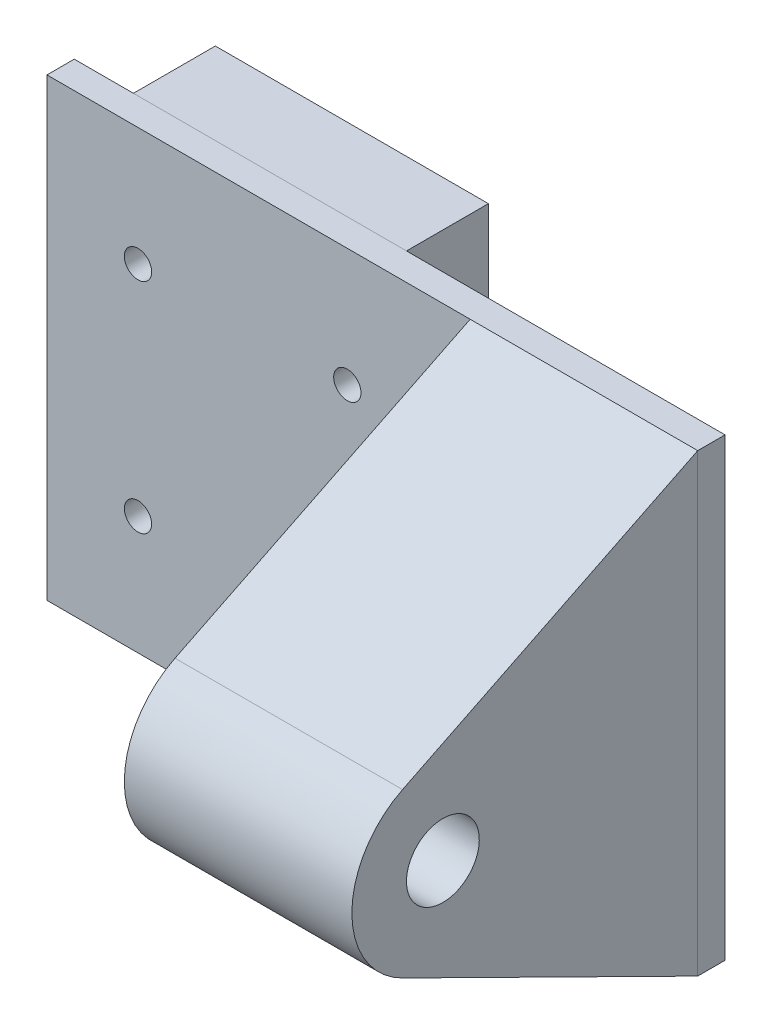
ISO-10303-21;
HEADER;
FILE_DESCRIPTION(('STEP AP214'),'2;1');
FILE_NAME('part.step','',(''),(''),'','','');
FILE_SCHEMA(('AUTOMOTIVE_DESIGN { 1 0 10303 214 1 1 1 1 }'));
ENDSEC;
DATA;
#1=APPLICATION_CONTEXT('core data for automotive mechanical design processes');
#2=APPLICATION_PROTOCOL_DEFINITION('international standard','automotive_design',2000,#1);
#3=PRODUCT_CONTEXT('',#1,'mechanical');
#4=PRODUCT('Part','Part','',(#3));
#5=PRODUCT_RELATED_PRODUCT_CATEGORY('part','',(#4));
#6=PRODUCT_DEFINITION_FORMATION('','',#4);
#7=PRODUCT_DEFINITION_CONTEXT('part definition',#1,'design');
#8=PRODUCT_DEFINITION('design','',#6,#7);
#9=PRODUCT_DEFINITION_SHAPE('','',#8);
#10=(LENGTH_UNIT() NAMED_UNIT(*) SI_UNIT(.MILLI.,.METRE.));
#11=(NAMED_UNIT(*) PLANE_ANGLE_UNIT() SI_UNIT($,.RADIAN.));
#12=(NAMED_UNIT(*) SI_UNIT($,.STERADIAN.) SOLID_ANGLE_UNIT());
#13=UNCERTAINTY_MEASURE_WITH_UNIT(LENGTH_MEASURE(1.E-05),#10,'distance_accuracy_value','');
#14=(GEOMETRIC_REPRESENTATION_CONTEXT(3) GLOBAL_UNCERTAINTY_ASSIGNED_CONTEXT((#13)) GLOBAL_UNIT_ASSIGNED_CONTEXT((#10,
#11,#12)) REPRESENTATION_CONTEXT('',''));
#15=CARTESIAN_POINT('',(0.,0.,0.));
#16=DIRECTION('',(0.,0.,1.));
#17=DIRECTION('',(1.,0.,0.));
#18=AXIS2_PLACEMENT_3D('',#15,#16,#17);
#19=CARTESIAN_POINT('',(40.,33.9641088775517,44.4322400692426));
#20=DIRECTION('',(0.,0.896410887755167,0.443224006924257));
#21=DIRECTION('',(0.,-0.443224006924257,0.896410887755167));
#22=AXIS2_PLACEMENT_3D('',#19,#20,#21);
#23=PLANE('',#22);
#24=DIRECTION('',(0.,-0.443224006924257,0.896410887755167));
#25=VECTOR('',#24,1.);
#26=CARTESIAN_POINT('',(65.,33.9641088775517,44.4322400692426));
#27=LINE('',#26,#25);
#28=CARTESIAN_POINT('',(65.,50.,12.));
#29=VERTEX_POINT('',#28);
#30=CARTESIAN_POINT('',(65.,33.9641088775517,44.4322400692426));
#31=VERTEX_POINT('',#30);
#32=EDGE_CURVE('E111',#29,#31,#27,.T.);
#33=ORIENTED_EDGE('',*,*,#32,.F.);
#34=DIRECTION('',(1.,0.,0.));
#35=VECTOR('',#34,1.);
#36=CARTESIAN_POINT('',(40.,50.,12.));
#37=LINE('',#36,#35);
#38=CARTESIAN_POINT('',(40.,50.,12.));
#39=VERTEX_POINT('',#38);
#40=EDGE_CURVE('E12',#39,#29,#37,.T.);
#41=ORIENTED_EDGE('',*,*,#40,.F.);
#42=DIRECTION('',(0.,-0.443224006924257,0.896410887755167));
#43=VECTOR('',#42,1.);
#44=CARTESIAN_POINT('',(40.,33.9641088775517,44.4322400692426));
#45=LINE('',#44,#43);
#46=CARTESIAN_POINT('',(40.,33.9641088775517,44.4322400692426));
#47=VERTEX_POINT('',#46);
#48=EDGE_CURVE('E104',#39,#47,#45,.T.);
#49=ORIENTED_EDGE('',*,*,#48,.T.);
#50=DIRECTION('',(1.,0.,0.));
#51=VECTOR('',#50,1.);
#52=CARTESIAN_POINT('',(40.,33.9641088775517,44.4322400692426));
#53=LINE('',#52,#51);
#54=EDGE_CURVE('E49',#47,#31,#53,.T.);
#55=ORIENTED_EDGE('',*,*,#54,.T.);
#56=EDGE_LOOP('',(#33,#41,#49,#55));
#57=FACE_BOUND('',#56,.T.);
#58=ADVANCED_FACE('F46',(#57),#23,.T.);
#59=CARTESIAN_POINT('',(40.,50.,12.));
#60=DIRECTION('',(0.,0.,-1.));
#61=DIRECTION('',(-1.,0.,0.));
#62=AXIS2_PLACEMENT_3D('',#59,#60,#61);
#63=PLANE('',#62);
#64=DIRECTION('',(0.,1.,0.));
#65=VECTOR('',#64,1.);
#66=CARTESIAN_POINT('',(65.,50.,12.));
#67=LINE('',#66,#65);
#68=CARTESIAN_POINT('',(65.,0.,12.));
#69=VERTEX_POINT('',#68);
#70=EDGE_CURVE('E106',#69,#29,#67,.T.);
#71=ORIENTED_EDGE('',*,*,#70,.F.);
#72=DIRECTION('',(1.,0.,0.));
#73=VECTOR('',#72,1.);
#74=CARTESIAN_POINT('',(40.,0.,12.));
#75=LINE('',#74,#73);
#76=CARTESIAN_POINT('',(40.,0.,12.));
#77=VERTEX_POINT('',#76);
#78=EDGE_CURVE('E55',#77,#69,#75,.T.);
#79=ORIENTED_EDGE('',*,*,#78,.F.);
#80=DIRECTION('',(0.,1.,0.));
#81=VECTOR('',#80,1.);
#82=CARTESIAN_POINT('',(40.,50.,12.));
#83=LINE('',#82,#81);
#84=EDGE_CURVE('E101',#77,#39,#83,.T.);
#85=ORIENTED_EDGE('',*,*,#84,.T.);
#86=ORIENTED_EDGE('',*,*,#40,.T.);
#87=EDGE_LOOP('',(#71,#79,#85,#86));
#88=FACE_BOUND('',#87,.T.);
#89=ADVANCED_FACE('F122',(#88),#63,.T.);
#90=CARTESIAN_POINT('',(40.,0.,12.));
#91=DIRECTION('',(0.,-0.896410887755167,0.443224006924256));
#92=DIRECTION('',(0.,-0.443224006924256,-0.896410887755167));
#93=AXIS2_PLACEMENT_3D('',#90,#91,#92);
#94=PLANE('',#93);
#95=DIRECTION('',(0.,-0.443224006924256,-0.896410887755167));
#96=VECTOR('',#95,1.);
#97=CARTESIAN_POINT('',(65.,0.,12.));
#98=LINE('',#97,#96);
#99=CARTESIAN_POINT('',(65.,16.0358911224483,44.4322400692426));
#100=VERTEX_POINT('',#99);
#101=EDGE_CURVE('E96',#100,#69,#98,.T.);
#102=ORIENTED_EDGE('',*,*,#101,.F.);
#103=DIRECTION('',(1.,0.,0.));
#104=VECTOR('',#103,1.);
#105=CARTESIAN_POINT('',(40.,16.0358911224483,44.4322400692426));
#106=LINE('',#105,#104);
#107=CARTESIAN_POINT('',(40.,16.0358911224483,44.4322400692426));
#108=VERTEX_POINT('',#107);
#109=EDGE_CURVE('E91',#108,#100,#106,.T.);
#110=ORIENTED_EDGE('',*,*,#109,.F.);
#111=DIRECTION('',(0.,-0.443224006924256,-0.896410887755167));
#112=VECTOR('',#111,1.);
#113=CARTESIAN_POINT('',(40.,0.,12.));
#114=LINE('',#113,#112);
#115=EDGE_CURVE('E94',#108,#77,#114,.T.);
#116=ORIENTED_EDGE('',*,*,#115,.T.);
#117=ORIENTED_EDGE('',*,*,#78,.T.);
#118=EDGE_LOOP('',(#102,#110,#116,#117));
#119=FACE_BOUND('',#118,.T.);
#120=ADVANCED_FACE('F93',(#119),#94,.T.);
#121=CARTESIAN_POINT('',(40.,25.,40.));
#122=DIRECTION('',(1.,0.,0.));
#123=DIRECTION('',(0.,1.,0.));
#124=AXIS2_PLACEMENT_3D('',#121,#122,#123);
#125=CYLINDRICAL_SURFACE('',#124,10.);
#126=CARTESIAN_POINT('',(65.,25.,40.));
#127=DIRECTION('',(1.,0.,0.));
#128=DIRECTION('',(0.,1.,0.));
#129=AXIS2_PLACEMENT_3D('',#126,#127,#128);
#130=CIRCLE('',#129,10.);
#131=EDGE_CURVE('E114',#31,#100,#130,.T.);
#132=ORIENTED_EDGE('',*,*,#131,.F.);
#133=ORIENTED_EDGE('',*,*,#54,.F.);
#134=CARTESIAN_POINT('',(40.,25.,40.));
#135=DIRECTION('',(1.,0.,0.));
#136=DIRECTION('',(0.,1.,0.));
#137=AXIS2_PLACEMENT_3D('',#134,#135,#136);
#138=CIRCLE('',#137,10.);
#139=EDGE_CURVE('E100',#47,#108,#138,.T.);
#140=ORIENTED_EDGE('',*,*,#139,.T.);
#141=ORIENTED_EDGE('',*,*,#109,.T.);
#142=EDGE_LOOP('',(#132,#133,#140,#141));
#143=FACE_BOUND('',#142,.T.);
#144=ADVANCED_FACE('F103',(#143),#125,.T.);
#145=CARTESIAN_POINT('',(40.,25.,40.));
#146=DIRECTION('',(1.,0.,0.));
#147=DIRECTION('',(0.,1.,0.));
#148=AXIS2_PLACEMENT_3D('',#145,#146,#147);
#149=PLANE('',#148);
#150=CARTESIAN_POINT('',(40.,25.,40.));
#151=DIRECTION('',(1.,0.,0.));
#152=DIRECTION('',(0.,1.,0.));
#153=AXIS2_PLACEMENT_3D('',#150,#151,#152);
#154=CIRCLE('',#153,4.00000000000001);
#155=CARTESIAN_POINT('',(40.,29.,40.));
#156=VERTEX_POINT('',#155);
#157=EDGE_CURVE('E115',#156,#156,#154,.T.);
#158=ORIENTED_EDGE('',*,*,#157,.T.);
#159=EDGE_LOOP('',(#158));
#160=FACE_BOUND('',#159,.T.);
#161=ORIENTED_EDGE('',*,*,#48,.F.);
#162=ORIENTED_EDGE('',*,*,#84,.F.);
#163=ORIENTED_EDGE('',*,*,#115,.F.);
#164=ORIENTED_EDGE('',*,*,#139,.F.);
#165=EDGE_LOOP('',(#161,#162,#163,#164));
#166=FACE_BOUND('',#165,.T.);
#167=ADVANCED_FACE('F99',(#160,#166),#149,.F.);
#168=CARTESIAN_POINT('',(65.,25.,40.));
#169=DIRECTION('',(1.,0.,0.));
#170=DIRECTION('',(0.,1.,0.));
#171=AXIS2_PLACEMENT_3D('',#168,#169,#170);
#172=PLANE('',#171);
#173=CARTESIAN_POINT('',(65.,25.,40.));
#174=DIRECTION('',(1.,0.,0.));
#175=DIRECTION('',(0.,1.,0.));
#176=AXIS2_PLACEMENT_3D('',#173,#174,#175);
#177=CIRCLE('',#176,4.00000000000001);
#178=CARTESIAN_POINT('',(65.,29.,40.));
#179=VERTEX_POINT('',#178);
#180=EDGE_CURVE('E152',#179,#179,#177,.T.);
#181=ORIENTED_EDGE('',*,*,#180,.F.);
#182=EDGE_LOOP('',(#181));
#183=FACE_BOUND('',#182,.T.);
#184=ORIENTED_EDGE('',*,*,#32,.T.);
#185=ORIENTED_EDGE('',*,*,#131,.T.);
#186=ORIENTED_EDGE('',*,*,#101,.T.);
#187=ORIENTED_EDGE('',*,*,#70,.T.);
#188=EDGE_LOOP('',(#184,#185,#186,#187));
#189=FACE_BOUND('',#188,.T.);
#190=ADVANCED_FACE('F121',(#183,#189),#172,.T.);
#191=CARTESIAN_POINT('',(40.,25.,40.));
#192=DIRECTION('',(1.,0.,0.));
#193=DIRECTION('',(0.,1.,0.));
#194=AXIS2_PLACEMENT_3D('',#191,#192,#193);
#195=CYLINDRICAL_SURFACE('',#194,4.00000000000001);
#196=ORIENTED_EDGE('',*,*,#157,.F.);
#197=EDGE_LOOP('',(#196));
#198=FACE_BOUND('',#197,.T.);
#199=ORIENTED_EDGE('',*,*,#180,.T.);
#200=EDGE_LOOP('',(#199));
#201=FACE_BOUND('',#200,.T.);
#202=ADVANCED_FACE('F140',(#198,#201),#195,.F.);
#203=CLOSED_SHELL('',(#58,#89,#120,#144,#167,#190,#202));
#204=MANIFOLD_SOLID_BREP('B2',#203);
#205=CARTESIAN_POINT('',(-6.5,50.,12.));
#206=DIRECTION('',(1.,0.,0.));
#207=DIRECTION('',(0.,1.,0.));
#208=AXIS2_PLACEMENT_3D('',#205,#206,#207);
#209=PLANE('',#208);
#210=DIRECTION('',(0.,-1.,0.));
#211=VECTOR('',#210,1.);
#212=CARTESIAN_POINT('',(-6.5,50.,9.));
#213=LINE('',#212,#211);
#214=CARTESIAN_POINT('',(-6.5,50.,9.));
#215=VERTEX_POINT('',#214);
#216=CARTESIAN_POINT('',(-6.49999999999999,0.,9.));
#217=VERTEX_POINT('',#216);
#218=EDGE_CURVE('E266',#215,#217,#213,.T.);
#219=ORIENTED_EDGE('',*,*,#218,.T.);
#220=DIRECTION('',(0.,0.,-1.));
#221=VECTOR('',#220,1.);
#222=CARTESIAN_POINT('',(-6.49999999999999,0.,12.));
#223=LINE('',#222,#221);
#224=CARTESIAN_POINT('',(-6.49999999999999,0.,12.));
#225=VERTEX_POINT('',#224);
#226=EDGE_CURVE('E44',#225,#217,#223,.T.);
#227=ORIENTED_EDGE('',*,*,#226,.F.);
#228=DIRECTION('',(0.,-1.,0.));
#229=VECTOR('',#228,1.);
#230=CARTESIAN_POINT('',(-6.5,50.,12.));
#231=LINE('',#230,#229);
#232=CARTESIAN_POINT('',(-6.5,50.,12.));
#233=VERTEX_POINT('',#232);
#234=EDGE_CURVE('E253',#233,#225,#231,.T.);
#235=ORIENTED_EDGE('',*,*,#234,.F.);
#236=DIRECTION('',(0.,0.,-1.));
#237=VECTOR('',#236,1.);
#238=CARTESIAN_POINT('',(-6.5,50.,12.));
#239=LINE('',#238,#237);
#240=EDGE_CURVE('E262',#233,#215,#239,.T.);
#241=ORIENTED_EDGE('',*,*,#240,.T.);
#242=EDGE_LOOP('',(#219,#227,#235,#241));
#243=FACE_BOUND('',#242,.T.);
#244=ADVANCED_FACE('F200',(#243),#209,.F.);
#245=CARTESIAN_POINT('',(-6.49999999999999,0.,12.));
#246=DIRECTION('',(0.,1.,0.));
#247=DIRECTION('',(0.,0.,1.));
#248=AXIS2_PLACEMENT_3D('',#245,#246,#247);
#249=PLANE('',#248);
#250=DIRECTION('',(1.,0.,0.));
#251=VECTOR('',#250,1.);
#252=CARTESIAN_POINT('',(-6.49999999999999,0.,9.));
#253=LINE('',#252,#251);
#254=CARTESIAN_POINT('',(65.,0.,9.));
#255=VERTEX_POINT('',#254);
#256=EDGE_CURVE('E257',#217,#255,#253,.T.);
#257=ORIENTED_EDGE('',*,*,#256,.T.);
#258=DIRECTION('',(0.,0.,-1.));
#259=VECTOR('',#258,1.);
#260=CARTESIAN_POINT('',(65.,0.,12.));
#261=LINE('',#260,#259);
#262=CARTESIAN_POINT('',(65.,0.,12.));
#263=VERTEX_POINT('',#262);
#264=EDGE_CURVE('E209',#263,#255,#261,.T.);
#265=ORIENTED_EDGE('',*,*,#264,.F.);
#266=DIRECTION('',(1.,0.,0.));
#267=VECTOR('',#266,1.);
#268=CARTESIAN_POINT('',(-6.49999999999999,0.,12.));
#269=LINE('',#268,#267);
#270=EDGE_CURVE('E248',#225,#263,#269,.T.);
#271=ORIENTED_EDGE('',*,*,#270,.F.);
#272=ORIENTED_EDGE('',*,*,#226,.T.);
#273=EDGE_LOOP('',(#257,#265,#271,#272));
#274=FACE_BOUND('',#273,.T.);
#275=ADVANCED_FACE('F256',(#274),#249,.F.);
#276=CARTESIAN_POINT('',(65.,50.,12.));
#277=DIRECTION('',(-1.,0.,0.));
#278=DIRECTION('',(0.,0.,1.));
#279=AXIS2_PLACEMENT_3D('',#276,#277,#278);
#280=PLANE('',#279);
#281=DIRECTION('',(0.,1.,0.));
#282=VECTOR('',#281,1.);
#283=CARTESIAN_POINT('',(65.,50.,9.));
#284=LINE('',#283,#282);
#285=CARTESIAN_POINT('',(65.,50.,9.));
#286=VERTEX_POINT('',#285);
#287=EDGE_CURVE('E235',#255,#286,#284,.T.);
#288=ORIENTED_EDGE('',*,*,#287,.T.);
#289=DIRECTION('',(0.,0.,-1.));
#290=VECTOR('',#289,1.);
#291=CARTESIAN_POINT('',(65.,50.,12.));
#292=LINE('',#291,#290);
#293=CARTESIAN_POINT('',(65.,50.,12.));
#294=VERTEX_POINT('',#293);
#295=EDGE_CURVE('E258',#294,#286,#292,.T.);
#296=ORIENTED_EDGE('',*,*,#295,.F.);
#297=DIRECTION('',(0.,1.,0.));
#298=VECTOR('',#297,1.);
#299=CARTESIAN_POINT('',(65.,50.,12.));
#300=LINE('',#299,#298);
#301=EDGE_CURVE('E251',#263,#294,#300,.T.);
#302=ORIENTED_EDGE('',*,*,#301,.F.);
#303=ORIENTED_EDGE('',*,*,#264,.T.);
#304=EDGE_LOOP('',(#288,#296,#302,#303));
#305=FACE_BOUND('',#304,.T.);
#306=ADVANCED_FACE('F260',(#305),#280,.F.);
#307=CARTESIAN_POINT('',(-6.5,50.,12.));
#308=DIRECTION('',(0.,-1.,0.));
#309=DIRECTION('',(0.,0.,-1.));
#310=AXIS2_PLACEMENT_3D('',#307,#308,#309);
#311=PLANE('',#310);
#312=DIRECTION('',(-1.,0.,0.));
#313=VECTOR('',#312,1.);
#314=CARTESIAN_POINT('',(-6.5,50.,9.));
#315=LINE('',#314,#313);
#316=EDGE_CURVE('E241',#286,#215,#315,.T.);
#317=ORIENTED_EDGE('',*,*,#316,.T.);
#318=ORIENTED_EDGE('',*,*,#240,.F.);
#319=DIRECTION('',(-1.,0.,0.));
#320=VECTOR('',#319,1.);
#321=CARTESIAN_POINT('',(-6.5,50.,12.));
#322=LINE('',#321,#320);
#323=EDGE_CURVE('E218',#294,#233,#322,.T.);
#324=ORIENTED_EDGE('',*,*,#323,.F.);
#325=ORIENTED_EDGE('',*,*,#295,.T.);
#326=EDGE_LOOP('',(#317,#318,#324,#325));
#327=FACE_BOUND('',#326,.T.);
#328=ADVANCED_FACE('F304',(#327),#311,.F.);
#329=CARTESIAN_POINT('',(0.,0.,12.));
#330=DIRECTION('',(0.,0.,1.));
#331=DIRECTION('',(1.,0.,0.));
#332=AXIS2_PLACEMENT_3D('',#329,#330,#331);
#333=PLANE('',#332);
#334=CARTESIAN_POINT('',(3.49999999999999,37.,12.));
#335=DIRECTION('',(0.,0.,1.));
#336=DIRECTION('',(-1.,0.,0.));
#337=AXIS2_PLACEMENT_3D('',#334,#335,#336);
#338=CIRCLE('',#337,1.5);
#339=CARTESIAN_POINT('',(1.99999999999999,37.,12.));
#340=VERTEX_POINT('',#339);
#341=EDGE_CURVE('E293',#340,#340,#338,.T.);
#342=ORIENTED_EDGE('',*,*,#341,.F.);
#343=EDGE_LOOP('',(#342));
#344=FACE_BOUND('',#343,.T.);
#345=CARTESIAN_POINT('',(3.5,13.,12.));
#346=DIRECTION('',(0.,0.,1.));
#347=DIRECTION('',(1.,0.,0.));
#348=AXIS2_PLACEMENT_3D('',#345,#346,#347);
#349=CIRCLE('',#348,1.5);
#350=CARTESIAN_POINT('',(5.,13.,12.));
#351=VERTEX_POINT('',#350);
#352=EDGE_CURVE('E283',#351,#351,#349,.T.);
#353=ORIENTED_EDGE('',*,*,#352,.F.);
#354=EDGE_LOOP('',(#353));
#355=FACE_BOUND('',#354,.T.);
#356=CARTESIAN_POINT('',(26.5,13.,12.));
#357=DIRECTION('',(0.,0.,1.));
#358=DIRECTION('',(-1.,0.,0.));
#359=AXIS2_PLACEMENT_3D('',#356,#357,#358);
#360=CIRCLE('',#359,1.5);
#361=CARTESIAN_POINT('',(25.,13.,12.));
#362=VERTEX_POINT('',#361);
#363=EDGE_CURVE('E280',#362,#362,#360,.T.);
#364=ORIENTED_EDGE('',*,*,#363,.F.);
#365=EDGE_LOOP('',(#364));
#366=FACE_BOUND('',#365,.T.);
#367=CARTESIAN_POINT('',(26.5,37.,12.));
#368=DIRECTION('',(0.,0.,1.));
#369=DIRECTION('',(1.,0.,0.));
#370=AXIS2_PLACEMENT_3D('',#367,#368,#369);
#371=CIRCLE('',#370,1.5);
#372=CARTESIAN_POINT('',(28.,37.,12.));
#373=VERTEX_POINT('',#372);
#374=EDGE_CURVE('E277',#373,#373,#371,.T.);
#375=ORIENTED_EDGE('',*,*,#374,.F.);
#376=EDGE_LOOP('',(#375));
#377=FACE_BOUND('',#376,.T.);
#378=ORIENTED_EDGE('',*,*,#234,.T.);
#379=ORIENTED_EDGE('',*,*,#270,.T.);
#380=ORIENTED_EDGE('',*,*,#301,.T.);
#381=ORIENTED_EDGE('',*,*,#323,.T.);
#382=EDGE_LOOP('',(#378,#379,#380,#381));
#383=FACE_BOUND('',#382,.T.);
#384=ADVANCED_FACE('F249',(#344,#355,#366,#377,#383),#333,.T.);
#385=CARTESIAN_POINT('',(0.,0.,9.));
#386=DIRECTION('',(0.,0.,1.));
#387=DIRECTION('',(1.,0.,0.));
#388=AXIS2_PLACEMENT_3D('',#385,#386,#387);
#389=PLANE('',#388);
#390=CARTESIAN_POINT('',(3.49999999999999,37.,9.));
#391=DIRECTION('',(0.,0.,1.));
#392=DIRECTION('',(1.,0.,0.));
#393=AXIS2_PLACEMENT_3D('',#390,#391,#392);
#394=CIRCLE('',#393,1.5);
#395=CARTESIAN_POINT('',(5.,37.,9.));
#396=VERTEX_POINT('',#395);
#397=EDGE_CURVE('E203',#396,#396,#394,.T.);
#398=ORIENTED_EDGE('',*,*,#397,.T.);
#399=EDGE_LOOP('',(#398));
#400=FACE_BOUND('',#399,.T.);
#401=CARTESIAN_POINT('',(3.5,13.,9.));
#402=DIRECTION('',(0.,0.,1.));
#403=DIRECTION('',(1.,0.,0.));
#404=AXIS2_PLACEMENT_3D('',#401,#402,#403);
#405=CIRCLE('',#404,1.5);
#406=CARTESIAN_POINT('',(5.,13.,9.));
#407=VERTEX_POINT('',#406);
#408=EDGE_CURVE('E281',#407,#407,#405,.T.);
#409=ORIENTED_EDGE('',*,*,#408,.T.);
#410=EDGE_LOOP('',(#409));
#411=FACE_BOUND('',#410,.T.);
#412=CARTESIAN_POINT('',(26.5,13.,9.));
#413=DIRECTION('',(0.,0.,1.));
#414=DIRECTION('',(1.,0.,0.));
#415=AXIS2_PLACEMENT_3D('',#412,#413,#414);
#416=CIRCLE('',#415,1.5);
#417=CARTESIAN_POINT('',(28.,13.,9.));
#418=VERTEX_POINT('',#417);
#419=EDGE_CURVE('E278',#418,#418,#416,.T.);
#420=ORIENTED_EDGE('',*,*,#419,.T.);
#421=EDGE_LOOP('',(#420));
#422=FACE_BOUND('',#421,.T.);
#423=CARTESIAN_POINT('',(26.5,37.,9.));
#424=DIRECTION('',(0.,0.,1.));
#425=DIRECTION('',(1.,0.,0.));
#426=AXIS2_PLACEMENT_3D('',#423,#424,#425);
#427=CIRCLE('',#426,1.5);
#428=CARTESIAN_POINT('',(28.,37.,9.));
#429=VERTEX_POINT('',#428);
#430=EDGE_CURVE('E269',#429,#429,#427,.T.);
#431=ORIENTED_EDGE('',*,*,#430,.T.);
#432=EDGE_LOOP('',(#431));
#433=FACE_BOUND('',#432,.T.);
#434=ORIENTED_EDGE('',*,*,#218,.F.);
#435=ORIENTED_EDGE('',*,*,#316,.F.);
#436=ORIENTED_EDGE('',*,*,#287,.F.);
#437=ORIENTED_EDGE('',*,*,#256,.F.);
#438=EDGE_LOOP('',(#434,#435,#436,#437));
#439=FACE_BOUND('',#438,.T.);
#440=ADVANCED_FACE('F303',(#400,#411,#422,#433,#439),#389,.F.);
#441=CARTESIAN_POINT('',(26.5,37.,0.));
#442=DIRECTION('',(0.,0.,1.));
#443=DIRECTION('',(1.,0.,0.));
#444=AXIS2_PLACEMENT_3D('',#441,#442,#443);
#445=CYLINDRICAL_SURFACE('',#444,1.5);
#446=ORIENTED_EDGE('',*,*,#374,.T.);
#447=EDGE_LOOP('',(#446));
#448=FACE_BOUND('',#447,.T.);
#449=ORIENTED_EDGE('',*,*,#430,.F.);
#450=EDGE_LOOP('',(#449));
#451=FACE_BOUND('',#450,.T.);
#452=ADVANCED_FACE('F299',(#448,#451),#445,.F.);
#453=CARTESIAN_POINT('',(26.5,13.,0.));
#454=DIRECTION('',(0.,0.,1.));
#455=DIRECTION('',(1.,0.,0.));
#456=AXIS2_PLACEMENT_3D('',#453,#454,#455);
#457=CYLINDRICAL_SURFACE('',#456,1.5);
#458=ORIENTED_EDGE('',*,*,#363,.T.);
#459=EDGE_LOOP('',(#458));
#460=FACE_BOUND('',#459,.T.);
#461=ORIENTED_EDGE('',*,*,#419,.F.);
#462=EDGE_LOOP('',(#461));
#463=FACE_BOUND('',#462,.T.);
#464=ADVANCED_FACE('F353',(#460,#463),#457,.F.);
#465=CARTESIAN_POINT('',(3.5,13.,0.));
#466=DIRECTION('',(0.,0.,1.));
#467=DIRECTION('',(1.,0.,0.));
#468=AXIS2_PLACEMENT_3D('',#465,#466,#467);
#469=CYLINDRICAL_SURFACE('',#468,1.5);
#470=ORIENTED_EDGE('',*,*,#352,.T.);
#471=EDGE_LOOP('',(#470));
#472=FACE_BOUND('',#471,.T.);
#473=ORIENTED_EDGE('',*,*,#408,.F.);
#474=EDGE_LOOP('',(#473));
#475=FACE_BOUND('',#474,.T.);
#476=ADVANCED_FACE('F361',(#472,#475),#469,.F.);
#477=CARTESIAN_POINT('',(3.49999999999999,37.,0.));
#478=DIRECTION('',(0.,0.,1.));
#479=DIRECTION('',(1.,0.,0.));
#480=AXIS2_PLACEMENT_3D('',#477,#478,#479);
#481=CYLINDRICAL_SURFACE('',#480,1.5);
#482=ORIENTED_EDGE('',*,*,#341,.T.);
#483=EDGE_LOOP('',(#482));
#484=FACE_BOUND('',#483,.T.);
#485=ORIENTED_EDGE('',*,*,#397,.F.);
#486=EDGE_LOOP('',(#485));
#487=FACE_BOUND('',#486,.T.);
#488=ADVANCED_FACE('F371',(#484,#487),#481,.F.);
#489=CLOSED_SHELL('',(#244,#275,#306,#328,#384,#440,#452,#464,#476,#488));
#490=MANIFOLD_SOLID_BREP('B6',#489);
#491=CARTESIAN_POINT('',(0.,0.,9.));
#492=DIRECTION('',(1.,0.,0.));
#493=DIRECTION('',(0.,0.,-1.));
#494=AXIS2_PLACEMENT_3D('',#491,#492,#493);
#495=PLANE('',#494);
#496=DIRECTION('',(0.,-1.,0.));
#497=VECTOR('',#496,1.);
#498=CARTESIAN_POINT('',(0.,0.,0.));
#499=LINE('',#498,#497);
#500=CARTESIAN_POINT('',(0.,50.,0.));
#501=VERTEX_POINT('',#500);
#502=CARTESIAN_POINT('',(0.,0.,0.));
#503=VERTEX_POINT('',#502);
#504=EDGE_CURVE('E471',#501,#503,#499,.T.);
#505=ORIENTED_EDGE('',*,*,#504,.T.);
#506=DIRECTION('',(0.,0.,-1.));
#507=VECTOR('',#506,1.);
#508=CARTESIAN_POINT('',(0.,0.,9.));
#509=LINE('',#508,#507);
#510=CARTESIAN_POINT('',(0.,0.,9.));
#511=VERTEX_POINT('',#510);
#512=EDGE_CURVE('E198',#511,#503,#509,.T.);
#513=ORIENTED_EDGE('',*,*,#512,.F.);
#514=DIRECTION('',(0.,-1.,0.));
#515=VECTOR('',#514,1.);
#516=CARTESIAN_POINT('',(0.,0.,9.));
#517=LINE('',#516,#515);
#518=CARTESIAN_POINT('',(0.,50.,9.));
#519=VERTEX_POINT('',#518);
#520=EDGE_CURVE('E459',#519,#511,#517,.T.);
#521=ORIENTED_EDGE('',*,*,#520,.F.);
#522=DIRECTION('',(0.,0.,-1.));
#523=VECTOR('',#522,1.);
#524=CARTESIAN_POINT('',(0.,50.,9.));
#525=LINE('',#524,#523);
#526=EDGE_CURVE('E467',#519,#501,#525,.T.);
#527=ORIENTED_EDGE('',*,*,#526,.T.);
#528=EDGE_LOOP('',(#505,#513,#521,#527));
#529=FACE_BOUND('',#528,.T.);
#530=ADVANCED_FACE('F408',(#529),#495,.F.);
#531=CARTESIAN_POINT('',(0.,0.,9.));
#532=DIRECTION('',(0.,1.,0.));
#533=DIRECTION('',(0.,0.,1.));
#534=AXIS2_PLACEMENT_3D('',#531,#532,#533);
#535=PLANE('',#534);
#536=DIRECTION('',(1.,0.,0.));
#537=VECTOR('',#536,1.);
#538=CARTESIAN_POINT('',(0.,0.,0.));
#539=LINE('',#538,#537);
#540=CARTESIAN_POINT('',(30.,0.,0.));
#541=VERTEX_POINT('',#540);
#542=EDGE_CURVE('E463',#503,#541,#539,.T.);
#543=ORIENTED_EDGE('',*,*,#542,.T.);
#544=DIRECTION('',(0.,0.,-1.));
#545=VECTOR('',#544,1.);
#546=CARTESIAN_POINT('',(30.,0.,9.));
#547=LINE('',#546,#545);
#548=CARTESIAN_POINT('',(30.,0.,9.));
#549=VERTEX_POINT('',#548);
#550=EDGE_CURVE('E416',#549,#541,#547,.T.);
#551=ORIENTED_EDGE('',*,*,#550,.F.);
#552=DIRECTION('',(1.,0.,0.));
#553=VECTOR('',#552,1.);
#554=CARTESIAN_POINT('',(0.,0.,9.));
#555=LINE('',#554,#553);
#556=EDGE_CURVE('E454',#511,#549,#555,.T.);
#557=ORIENTED_EDGE('',*,*,#556,.F.);
#558=ORIENTED_EDGE('',*,*,#512,.T.);
#559=EDGE_LOOP('',(#543,#551,#557,#558));
#560=FACE_BOUND('',#559,.T.);
#561=ADVANCED_FACE('F462',(#560),#535,.F.);
#562=CARTESIAN_POINT('',(30.,0.,9.));
#563=DIRECTION('',(-1.,0.,0.));
#564=DIRECTION('',(0.,0.,1.));
#565=AXIS2_PLACEMENT_3D('',#562,#563,#564);
#566=PLANE('',#565);
#567=DIRECTION('',(0.,1.,0.));
#568=VECTOR('',#567,1.);
#569=CARTESIAN_POINT('',(30.,0.,0.));
#570=LINE('',#569,#568);
#571=CARTESIAN_POINT('',(30.,50.,0.));
#572=VERTEX_POINT('',#571);
#573=EDGE_CURVE('E441',#541,#572,#570,.T.);
#574=ORIENTED_EDGE('',*,*,#573,.T.);
#575=DIRECTION('',(0.,0.,-1.));
#576=VECTOR('',#575,1.);
#577=CARTESIAN_POINT('',(30.,50.,9.));
#578=LINE('',#577,#576);
#579=CARTESIAN_POINT('',(30.,50.,9.));
#580=VERTEX_POINT('',#579);
#581=EDGE_CURVE('E464',#580,#572,#578,.T.);
#582=ORIENTED_EDGE('',*,*,#581,.F.);
#583=DIRECTION('',(0.,1.,0.));
#584=VECTOR('',#583,1.);
#585=CARTESIAN_POINT('',(30.,0.,9.));
#586=LINE('',#585,#584);
#587=EDGE_CURVE('E457',#549,#580,#586,.T.);
#588=ORIENTED_EDGE('',*,*,#587,.F.);
#589=ORIENTED_EDGE('',*,*,#550,.T.);
#590=EDGE_LOOP('',(#574,#582,#588,#589));
#591=FACE_BOUND('',#590,.T.);
#592=ADVANCED_FACE('F465',(#591),#566,.F.);
#593=CARTESIAN_POINT('',(0.,50.,9.));
#594=DIRECTION('',(0.,-1.,0.));
#595=DIRECTION('',(0.,0.,-1.));
#596=AXIS2_PLACEMENT_3D('',#593,#594,#595);
#597=PLANE('',#596);
#598=DIRECTION('',(-1.,0.,0.));
#599=VECTOR('',#598,1.);
#600=CARTESIAN_POINT('',(0.,50.,0.));
#601=LINE('',#600,#599);
#602=EDGE_CURVE('E447',#572,#501,#601,.T.);
#603=ORIENTED_EDGE('',*,*,#602,.T.);
#604=ORIENTED_EDGE('',*,*,#526,.F.);
#605=DIRECTION('',(-1.,0.,0.));
#606=VECTOR('',#605,1.);
#607=CARTESIAN_POINT('',(0.,50.,9.));
#608=LINE('',#607,#606);
#609=EDGE_CURVE('E424',#580,#519,#608,.T.);
#610=ORIENTED_EDGE('',*,*,#609,.F.);
#611=ORIENTED_EDGE('',*,*,#581,.T.);
#612=EDGE_LOOP('',(#603,#604,#610,#611));
#613=FACE_BOUND('',#612,.T.);
#614=ADVANCED_FACE('F478',(#613),#597,.F.);
#615=CARTESIAN_POINT('',(0.,0.,9.));
#616=DIRECTION('',(0.,0.,-1.));
#617=DIRECTION('',(-1.,0.,0.));
#618=AXIS2_PLACEMENT_3D('',#615,#616,#617);
#619=PLANE('',#618);
#620=ORIENTED_EDGE('',*,*,#520,.T.);
#621=ORIENTED_EDGE('',*,*,#556,.T.);
#622=ORIENTED_EDGE('',*,*,#587,.T.);
#623=ORIENTED_EDGE('',*,*,#609,.T.);
#624=EDGE_LOOP('',(#620,#621,#622,#623));
#625=FACE_BOUND('',#624,.T.);
#626=ADVANCED_FACE('F455',(#625),#619,.F.);
#627=CARTESIAN_POINT('',(0.,0.,0.));
#628=DIRECTION('',(0.,0.,-1.));
#629=DIRECTION('',(-1.,0.,0.));
#630=AXIS2_PLACEMENT_3D('',#627,#628,#629);
#631=PLANE('',#630);
#632=ORIENTED_EDGE('',*,*,#504,.F.);
#633=ORIENTED_EDGE('',*,*,#602,.F.);
#634=ORIENTED_EDGE('',*,*,#573,.F.);
#635=ORIENTED_EDGE('',*,*,#542,.F.);
#636=EDGE_LOOP('',(#632,#633,#634,#635));
#637=FACE_BOUND('',#636,.T.);
#638=ADVANCED_FACE('F481',(#637),#631,.T.);
#639=CLOSED_SHELL('',(#530,#561,#592,#614,#626,#638));
#640=MANIFOLD_SOLID_BREP('B38_NOT_SHOWN',#639);
#641=ADVANCED_BREP_SHAPE_REPRESENTATION('',(#18,#204,#490,#640),#14);
#642=SHAPE_DEFINITION_REPRESENTATION(#9,#641);
ENDSEC;
END-ISO-10303-21;
